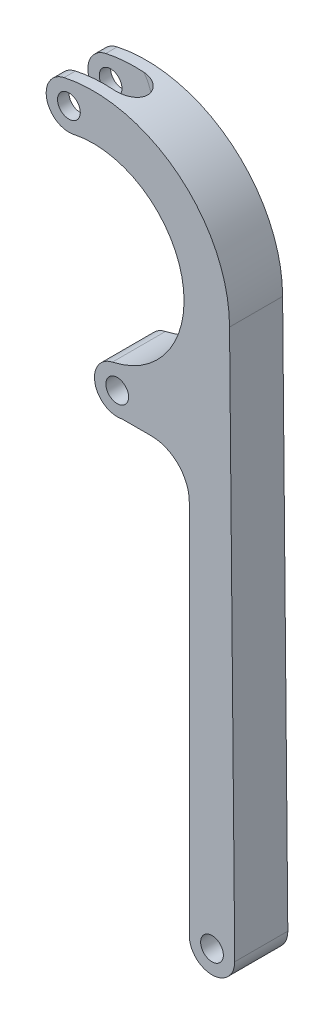
ISO-10303-21;
HEADER;
FILE_DESCRIPTION(('STEP AP214'),'2;1');
FILE_NAME('part.step','',(''),(''),'','','');
FILE_SCHEMA(('AUTOMOTIVE_DESIGN { 1 0 10303 214 1 1 1 1 }'));
ENDSEC;
DATA;
#1=APPLICATION_CONTEXT('core data for automotive mechanical design processes');
#2=APPLICATION_PROTOCOL_DEFINITION('international standard','automotive_design',2000,#1);
#3=PRODUCT_CONTEXT('',#1,'mechanical');
#4=PRODUCT('Part','Part','',(#3));
#5=PRODUCT_RELATED_PRODUCT_CATEGORY('part','',(#4));
#6=PRODUCT_DEFINITION_FORMATION('','',#4);
#7=PRODUCT_DEFINITION_CONTEXT('part definition',#1,'design');
#8=PRODUCT_DEFINITION('design','',#6,#7);
#9=PRODUCT_DEFINITION_SHAPE('','',#8);
#10=(LENGTH_UNIT() NAMED_UNIT(*) SI_UNIT(.MILLI.,.METRE.));
#11=(NAMED_UNIT(*) PLANE_ANGLE_UNIT() SI_UNIT($,.RADIAN.));
#12=(NAMED_UNIT(*) SI_UNIT($,.STERADIAN.) SOLID_ANGLE_UNIT());
#13=UNCERTAINTY_MEASURE_WITH_UNIT(LENGTH_MEASURE(1.E-05),#10,'distance_accuracy_value','');
#14=(GEOMETRIC_REPRESENTATION_CONTEXT(3) GLOBAL_UNCERTAINTY_ASSIGNED_CONTEXT((#13)) GLOBAL_UNIT_ASSIGNED_CONTEXT((#10,
#11,#12)) REPRESENTATION_CONTEXT('',''));
#15=CARTESIAN_POINT('',(0.,0.,0.));
#16=DIRECTION('',(0.,0.,1.));
#17=DIRECTION('',(1.,0.,0.));
#18=AXIS2_PLACEMENT_3D('',#15,#16,#17);
#19=CARTESIAN_POINT('',(-31.3728893299313,144.315290917684,14.));
#20=DIRECTION('',(0.,0.,-1.));
#21=DIRECTION('',(-1.,0.,0.));
#22=AXIS2_PLACEMENT_3D('',#19,#20,#21);
#23=CYLINDRICAL_SURFACE('',#22,36.);
#24=CARTESIAN_POINT('',(-31.3728893299313,144.315290917684,3.));
#25=DIRECTION('',(0.,0.,1.));
#26=DIRECTION('',(1.,0.,0.));
#27=AXIS2_PLACEMENT_3D('',#24,#25,#26);
#28=CIRCLE('',#27,36.);
#29=CARTESIAN_POINT('',(-28.9479901937246,180.233529518418,3.));
#30=VERTEX_POINT('',#29);
#31=CARTESIAN_POINT('',(-39.0203565258489,179.493640018905,3.));
#32=VERTEX_POINT('',#31);
#33=EDGE_CURVE('E206',#30,#32,#28,.T.);
#34=ORIENTED_EDGE('',*,*,#33,.F.);
#35=CARTESIAN_POINT('',(-28.9479901937246,180.233529518418,3.));
#36=CARTESIAN_POINT('',(-28.7795770568085,180.22216984961,3.00000045385362));
#37=CARTESIAN_POINT('',(-28.6112037438947,180.209602817332,3.00613336119898));
#38=CARTESIAN_POINT('',(-28.2754195237185,180.182182308598,3.03118744930425));
#39=CARTESIAN_POINT('',(-28.1080098703035,180.167326346729,3.05012260791562));
#40=CARTESIAN_POINT('',(-27.774298860757,180.135375466643,3.10147761181141));
#41=CARTESIAN_POINT('',(-27.6080123581459,180.11826626739,3.13398661023149));
#42=CARTESIAN_POINT('',(-27.2791009242743,180.082151242318,3.21295336145437));
#43=CARTESIAN_POINT('',(-27.1164743130056,180.063146309404,3.25940456790079));
#44=CARTESIAN_POINT('',(-26.6936280261687,180.010868514646,3.4011255225236));
#45=CARTESIAN_POINT('',(-26.4375101168995,179.976244002783,3.50861757906822));
#46=CARTESIAN_POINT('',(-25.9470883056509,179.904923404875,3.76359822497031));
#47=CARTESIAN_POINT('',(-25.7127213989245,179.868233830316,3.91096612226816));
#48=CARTESIAN_POINT('',(-25.3122735439438,179.801947309506,4.21714219033011));
#49=CARTESIAN_POINT('',(-25.1413907592226,179.772220222258,4.36957398920457));
#50=CARTESIAN_POINT('',(-24.905510629598,179.729687104965,4.61794944811057));
#51=CARTESIAN_POINT('',(-24.8302433366596,179.715842873747,4.70410002418329));
#52=CARTESIAN_POINT('',(-24.6873893509335,179.689142202842,4.88266955039365));
#53=CARTESIAN_POINT('',(-24.6197991910184,179.67628531811,4.97508564056015));
#54=CARTESIAN_POINT('',(-24.4925842095496,179.651754280422,5.16662098814801));
#55=CARTESIAN_POINT('',(-24.4330364676256,179.640091800642,5.26579304268483));
#56=CARTESIAN_POINT('',(-24.323538534103,179.618403645534,5.46941697841905));
#57=CARTESIAN_POINT('',(-24.2735830434926,179.608377066954,5.57386590401637));
#58=CARTESIAN_POINT('',(-24.1841295218186,179.590265300523,5.78712510066476));
#59=CARTESIAN_POINT('',(-24.1446147890766,179.582177014013,5.8959280816446));
#60=CARTESIAN_POINT('',(-24.0766695057924,179.568182639053,6.11702134767248));
#61=CARTESIAN_POINT('',(-24.0482324603552,179.562275272026,6.22930954749654));
#62=CARTESIAN_POINT('',(-24.0040553419754,179.55306608466,6.45088889530806));
#63=CARTESIAN_POINT('',(-23.9877744159436,179.549653439117,6.56006758396653));
#64=CARTESIAN_POINT('',(-23.9660117217184,179.545082100899,6.77949131024113));
#65=CARTESIAN_POINT('',(-23.9605251923654,179.543922414499,6.88973585615964));
#66=CARTESIAN_POINT('',(-23.9605600332046,179.543935149287,7.));
#67=B_SPLINE_CURVE_WITH_KNOTS('',3,(#35,#36,#37,#38,#39,#40,#41,#42,#43,#44,#45,#46,#47,#48,#49,
#50,#51,#52,#53,#54,#55,#56,#57,#58,#59,#60,#61,#62,#63,#64,#65,#66),.UNSPECIFIED.,.F.,.F.,(4,2,
2,2,2,2,2,2,2,2,2,2,2,2,2,4),(0.,0.506331687418498,1.01321709641114,1.5234854491179,
2.0335145867168,2.86972912066764,3.70344046291756,4.39309837160743,4.73843681901375,
5.083618680161,5.43190404937826,5.77999645954443,6.12752862151333,6.47485671611996,
6.80562039055201,7.13623814001269),.UNSPECIFIED.);
#68=CARTESIAN_POINT('',(-23.9605600332046,179.543935149288,7.));
#69=VERTEX_POINT('',#68);
#70=EDGE_CURVE('E45',#30,#69,#67,.T.);
#71=ORIENTED_EDGE('',*,*,#70,.T.);
#72=CARTESIAN_POINT('',(-23.9605600332046,179.543935149288,7.));
#73=CARTESIAN_POINT('',(-23.9605390359983,179.543927381125,7.09763453826813));
#74=CARTESIAN_POINT('',(-23.9648350243243,179.544834555989,7.19525790085211));
#75=CARTESIAN_POINT('',(-23.9818998463653,179.54842039755,7.38968910717928));
#76=CARTESIAN_POINT('',(-23.9946651661655,179.55109832956,7.48649727228477));
#77=CARTESIAN_POINT('',(-24.0284211619861,179.558149289769,7.67809554084558));
#78=CARTESIAN_POINT('',(-24.0493694034945,179.56251357175,7.77289343729455));
#79=CARTESIAN_POINT('',(-24.0991790551356,179.572826049637,7.96027618100451));
#80=CARTESIAN_POINT('',(-24.1280409363155,179.578774339828,8.05286089617254));
#81=CARTESIAN_POINT('',(-24.2258815890671,179.598782048608,8.32610659932321));
#82=CARTESIAN_POINT('',(-24.3061912580322,179.615020626096,8.50267888516191));
#83=CARTESIAN_POINT('',(-24.493251902258,179.651952156266,8.840675288737));
#84=CARTESIAN_POINT('',(-24.6000308426015,179.672649816971,9.00208313474946));
#85=CARTESIAN_POINT('',(-24.8430377187636,179.718358472298,9.31648755224717));
#86=CARTESIAN_POINT('',(-24.9806632490922,179.743555404174,9.46837294987783));
#87=CARTESIAN_POINT('',(-25.2760912297285,179.795589207871,9.75057447119266));
#88=CARTESIAN_POINT('',(-25.4338996813555,179.822426566222,9.88088415286238));
#89=CARTESIAN_POINT('',(-25.7929934799788,179.880766246256,10.1392919684144));
#90=CARTESIAN_POINT('',(-25.9971407976064,179.912300293487,10.2633987468435));
#91=CARTESIAN_POINT('',(-26.4210482244992,179.973743735603,10.4817667129386));
#92=CARTESIAN_POINT('',(-26.6408211004211,180.003651765938,10.5760031442402));
#93=CARTESIAN_POINT('',(-27.1341867993963,180.065904930496,10.7508112261382));
#94=CARTESIAN_POINT('',(-27.4100119067145,180.097615625276,10.8252862230458));
#95=CARTESIAN_POINT('',(-27.969701804709,180.155177061006,10.9351670561534));
#96=CARTESIAN_POINT('',(-28.2535623959536,180.181030801507,10.9705929268774));
#97=CARTESIAN_POINT('',(-28.6066914699344,180.208923722046,10.991864372818));
#98=CARTESIAN_POINT('',(-28.6749541064659,180.214118995282,10.9949262630547));
#99=CARTESIAN_POINT('',(-28.8114651730549,180.224116603336,10.998991903329));
#100=CARTESIAN_POINT('',(-28.8797134669732,180.228919523455,10.9999987748663));
#101=CARTESIAN_POINT('',(-28.9479901937246,180.233529518418,11.));
#102=B_SPLINE_CURVE_WITH_KNOTS('',3,(#72,#73,#74,#75,#76,#77,#78,#79,#80,#81,#82,#83,#84,#85,
#86,#87,#88,#89,#90,#91,#92,#93,#94,#95,#96,#97,#98,#99,#100,#101),.UNSPECIFIED.,.F.,.F.,(4,2,2,
2,2,2,2,2,2,2,2,2,2,2,4),(0.,0.292786386882828,0.585451372972699,0.876618402825911,
1.16780276770935,1.74890745554863,2.33062872340416,2.94778295442163,3.56512112255338,
4.285390235736,5.00625475215072,5.8655120095498,6.72432821138149,6.92989819626401,
7.13515569462084),.UNSPECIFIED.);
#103=CARTESIAN_POINT('',(-28.9479901937246,180.233529518418,11.));
#104=VERTEX_POINT('',#103);
#105=EDGE_CURVE('E177',#69,#104,#102,.T.);
#106=ORIENTED_EDGE('',*,*,#105,.T.);
#107=CARTESIAN_POINT('',(-31.3728893299313,144.315290917684,11.));
#108=DIRECTION('',(0.,0.,1.));
#109=DIRECTION('',(1.,0.,0.));
#110=AXIS2_PLACEMENT_3D('',#107,#108,#109);
#111=CIRCLE('',#110,36.);
#112=CARTESIAN_POINT('',(-39.0203565258489,179.493640018905,11.));
#113=VERTEX_POINT('',#112);
#114=EDGE_CURVE('E155',#104,#113,#111,.T.);
#115=ORIENTED_EDGE('',*,*,#114,.T.);
#116=DIRECTION('',(0.,0.,-1.));
#117=VECTOR('',#116,1.);
#118=CARTESIAN_POINT('',(-39.0203565258489,179.493640018905,14.));
#119=LINE('',#118,#117);
#120=CARTESIAN_POINT('',(-39.0203565258489,179.493640018905,14.));
#121=VERTEX_POINT('',#120);
#122=EDGE_CURVE('E154',#121,#113,#119,.T.);
#123=ORIENTED_EDGE('',*,*,#122,.F.);
#124=CARTESIAN_POINT('',(-31.3728893299313,144.315290917684,14.));
#125=DIRECTION('',(0.,0.,1.));
#126=DIRECTION('',(1.,0.,0.));
#127=AXIS2_PLACEMENT_3D('',#124,#125,#126);
#128=CIRCLE('',#127,36.);
#129=CARTESIAN_POINT('',(4.6271106700687,144.315290917684,14.));
#130=VERTEX_POINT('',#129);
#131=EDGE_CURVE('E310',#130,#121,#128,.T.);
#132=ORIENTED_EDGE('',*,*,#131,.F.);
#133=DIRECTION('',(0.,0.,-1.));
#134=VECTOR('',#133,1.);
#135=CARTESIAN_POINT('',(4.6271106700687,144.315290917684,14.));
#136=LINE('',#135,#134);
#137=CARTESIAN_POINT('',(4.6271106700687,144.315290917684,0.));
#138=VERTEX_POINT('',#137);
#139=EDGE_CURVE('E269',#130,#138,#136,.T.);
#140=ORIENTED_EDGE('',*,*,#139,.T.);
#141=CARTESIAN_POINT('',(-31.3728893299313,144.315290917684,0.));
#142=DIRECTION('',(0.,0.,1.));
#143=DIRECTION('',(1.,0.,0.));
#144=AXIS2_PLACEMENT_3D('',#141,#142,#143);
#145=CIRCLE('',#144,36.);
#146=CARTESIAN_POINT('',(-39.0203565258489,179.493640018905,0.));
#147=VERTEX_POINT('',#146);
#148=EDGE_CURVE('E211',#138,#147,#145,.T.);
#149=ORIENTED_EDGE('',*,*,#148,.T.);
#150=EDGE_CURVE('E160',#32,#147,#119,.T.);
#151=ORIENTED_EDGE('',*,*,#150,.F.);
#152=EDGE_LOOP('',(#34,#71,#106,#115,#123,#132,#140,#149,#151));
#153=FACE_BOUND('',#152,.T.);
#154=ADVANCED_FACE('F35',(#153),#23,.T.);
#155=CARTESIAN_POINT('',(-37.7457786598626,173.630581835368,14.));
#156=DIRECTION('',(0.,0.,-1.));
#157=DIRECTION('',(-1.,0.,0.));
#158=AXIS2_PLACEMENT_3D('',#155,#156,#157);
#159=CYLINDRICAL_SURFACE('',#158,6.);
#160=CARTESIAN_POINT('',(-37.7457786598626,173.630581835368,3.));
#161=DIRECTION('',(0.,0.,1.));
#162=DIRECTION('',(1.,0.,0.));
#163=AXIS2_PLACEMENT_3D('',#160,#161,#162);
#164=CIRCLE('',#163,6.);
#165=CARTESIAN_POINT('',(-36.4712007938764,167.767523651831,3.));
#166=VERTEX_POINT('',#165);
#167=EDGE_CURVE('E212',#32,#166,#164,.T.);
#168=ORIENTED_EDGE('',*,*,#167,.F.);
#169=ORIENTED_EDGE('',*,*,#150,.T.);
#170=CARTESIAN_POINT('',(-37.7457786598626,173.630581835368,0.));
#171=DIRECTION('',(0.,0.,1.));
#172=DIRECTION('',(1.,0.,0.));
#173=AXIS2_PLACEMENT_3D('',#170,#171,#172);
#174=CIRCLE('',#173,6.);
#175=CARTESIAN_POINT('',(-36.4712007938764,167.767523651831,0.));
#176=VERTEX_POINT('',#175);
#177=EDGE_CURVE('E277',#147,#176,#174,.T.);
#178=ORIENTED_EDGE('',*,*,#177,.T.);
#179=DIRECTION('',(0.,0.,-1.));
#180=VECTOR('',#179,1.);
#181=CARTESIAN_POINT('',(-36.4712007938764,167.767523651831,14.));
#182=LINE('',#181,#180);
#183=EDGE_CURVE('E161',#166,#176,#182,.T.);
#184=ORIENTED_EDGE('',*,*,#183,.F.);
#185=EDGE_LOOP('',(#168,#169,#178,#184));
#186=FACE_BOUND('',#185,.T.);
#187=ADVANCED_FACE('F200',(#186),#159,.T.);
#188=CARTESIAN_POINT('',(-31.3728893299313,144.315290917684,14.));
#189=DIRECTION('',(0.,0.,-1.));
#190=DIRECTION('',(-1.,0.,0.));
#191=AXIS2_PLACEMENT_3D('',#188,#189,#190);
#192=CYLINDRICAL_SURFACE('',#191,24.);
#193=CARTESIAN_POINT('',(-28.2320581462812,168.108886263403,11.));
#194=CARTESIAN_POINT('',(-28.1132038579012,168.093205656364,11.0000156342808));
#195=CARTESIAN_POINT('',(-27.9944460880994,168.076614923278,10.995407358767));
#196=CARTESIAN_POINT('',(-27.7578742170777,168.041771032219,10.9767273571227));
#197=CARTESIAN_POINT('',(-27.6400605409011,168.023517166715,10.9626515869216));
#198=CARTESIAN_POINT('',(-27.4060348850144,167.985486742715,10.924788945821));
#199=CARTESIAN_POINT('',(-27.2898259143121,167.965707688126,10.9009858694993));
#200=CARTESIAN_POINT('',(-27.060090987255,167.924894305285,10.8435877593124));
#201=CARTESIAN_POINT('',(-26.9465646264443,167.903860167971,10.8099942118683));
#202=CARTESIAN_POINT('',(-26.7227413980658,167.860760796419,10.7329316543777));
#203=CARTESIAN_POINT('',(-26.6124544951594,167.838692832452,10.6894351761463));
#204=CARTESIAN_POINT('',(-26.3962909780126,167.793912201118,10.5927541725508));
#205=CARTESIAN_POINT('',(-26.290416064566,167.771199290698,10.5395659527645));
#206=CARTESIAN_POINT('',(-26.0841566993723,167.725554655109,10.4238854796658));
#207=CARTESIAN_POINT('',(-25.9837636675694,167.702623341948,10.3614083710445));
#208=CARTESIAN_POINT('',(-25.7890728862017,167.656906069204,10.2274607042863));
#209=CARTESIAN_POINT('',(-25.6947773052786,167.634120163907,10.15598697272));
#210=CARTESIAN_POINT('',(-25.5180114440172,167.590347202525,10.0086775724302));
#211=CARTESIAN_POINT('',(-25.4351774076616,167.569329515636,9.93328701868262));
#212=CARTESIAN_POINT('',(-25.2762549861329,167.528170766636,9.77542574940758));
#213=CARTESIAN_POINT('',(-25.200169061437,167.508030025626,9.69295247279585));
#214=CARTESIAN_POINT('',(-25.0553116989439,167.468991353547,9.52152874041109));
#215=CARTESIAN_POINT('',(-24.9865404229735,167.450093449977,9.43257814140924));
#216=CARTESIAN_POINT('',(-24.8567791530108,167.413880534224,9.24885491079914));
#217=CARTESIAN_POINT('',(-24.7957919103713,167.396566082339,9.15408023804637));
#218=CARTESIAN_POINT('',(-24.6277546943914,167.348236754498,8.86648441244799));
#219=CARTESIAN_POINT('',(-24.5322067845964,167.319893453601,8.66631274855984));
#220=CARTESIAN_POINT('',(-24.3750378199673,167.272574495183,8.25224523140534));
#221=CARTESIAN_POINT('',(-24.3133902703329,167.253591523305,8.0383602421863));
#222=CARTESIAN_POINT('',(-24.2420593217259,167.231487318174,7.68579528755043));
#223=CARTESIAN_POINT('',(-24.2215314746653,167.225079771836,7.54942201262831));
#224=CARTESIAN_POINT('',(-24.1941613216893,167.216512089066,7.27538351280315));
#225=CARTESIAN_POINT('',(-24.1872985885254,167.214345612966,7.13772052581551));
#226=CARTESIAN_POINT('',(-24.1873084351455,167.214361361798,7.));
#227=B_SPLINE_CURVE_WITH_KNOTS('',3,(#193,#194,#195,#196,#197,#198,#199,#200,#201,#202,#203,
#204,#205,#206,#207,#208,#209,#210,#211,#212,#213,#214,#215,#216,#217,#218,#219,#220,#221,#222,
#223,#224,#225,#226),.UNSPECIFIED.,.F.,.F.,(4,2,2,2,2,2,2,2,2,2,2,2,2,2,2,2,4),(0.,
0.359594922636991,0.719343545026276,1.07969395791203,1.43998968970729,1.80129723481446,
2.16274279698239,2.5236053893548,2.88459562940481,3.22605796457053,3.5676442952638,
3.9092381815278,4.25095247552542,4.91837250355704,5.58527016593029,5.99874971644978,
6.4116107130744),.UNSPECIFIED.);
#228=CARTESIAN_POINT('',(-28.2320581462812,168.108886263403,11.));
#229=VERTEX_POINT('',#228);
#230=CARTESIAN_POINT('',(-24.1873084351456,167.214361361798,7.));
#231=VERTEX_POINT('',#230);
#232=EDGE_CURVE('E51',#229,#231,#227,.T.);
#233=ORIENTED_EDGE('',*,*,#232,.T.);
#234=CARTESIAN_POINT('',(-24.1873084351456,167.214361361798,7.));
#235=CARTESIAN_POINT('',(-24.1872990476954,167.214352306921,6.88866573990113));
#236=CARTESIAN_POINT('',(-24.1917855649749,167.215766063678,6.77733301062676));
#237=CARTESIAN_POINT('',(-24.2096828165437,167.221373846479,6.55546193209507));
#238=CARTESIAN_POINT('',(-24.223093193515,167.225567761203,6.44492355121056));
#239=CARTESIAN_POINT('',(-24.2587574967053,167.236666443544,6.22550395225878));
#240=CARTESIAN_POINT('',(-24.2810049286375,167.243569220393,6.1166215780793));
#241=CARTESIAN_POINT('',(-24.3342092441014,167.259958315889,5.90120608821957));
#242=CARTESIAN_POINT('',(-24.3651660040211,167.269444597869,5.79467293921979));
#243=CARTESIAN_POINT('',(-24.4356175598808,167.29083473021,5.58467573576111));
#244=CARTESIAN_POINT('',(-24.4751153454292,167.302739426998,5.48121277041378));
#245=CARTESIAN_POINT('',(-24.5624183758654,167.328755667838,5.27809497031777));
#246=CARTESIAN_POINT('',(-24.6102266802478,167.342868024441,5.17844155458479));
#247=CARTESIAN_POINT('',(-24.7138161129311,167.37303692282,4.98374550292935));
#248=CARTESIAN_POINT('',(-24.7695929973704,167.389092429033,4.88870044857111));
#249=CARTESIAN_POINT('',(-24.8888060395813,167.422876291165,4.70380504035586));
#250=CARTESIAN_POINT('',(-24.9522450051164,167.4406052598,4.61395660874274));
#251=CARTESIAN_POINT('',(-25.0862469952877,167.477392422343,4.44026146263383));
#252=CARTESIAN_POINT('',(-25.1567986878788,167.496448487388,4.35640555401584));
#253=CARTESIAN_POINT('',(-25.3046664814596,167.535594985163,4.1950895264299));
#254=CARTESIAN_POINT('',(-25.3819850569468,167.555685795162,4.11763176741773));
#255=CARTESIAN_POINT('',(-25.5427988096175,167.596547796144,3.96970228556316));
#256=CARTESIAN_POINT('',(-25.626290930456,167.617318647657,3.89922714573194));
#257=CARTESIAN_POINT('',(-25.7989393731989,167.65921890646,3.76564512495483));
#258=CARTESIAN_POINT('',(-25.8880977490861,167.680348441713,3.7025409397305));
#259=CARTESIAN_POINT('',(-26.0717650343891,167.722704130289,3.58388617897434));
#260=CARTESIAN_POINT('',(-26.1662923698337,167.743930353729,3.52836415880804));
#261=CARTESIAN_POINT('',(-26.3597652645137,167.786089667647,3.42542041758196));
#262=CARTESIAN_POINT('',(-26.4587124956963,167.807022643195,3.37800179515271));
#263=CARTESIAN_POINT('',(-26.6603132211899,167.848293404858,3.29148760399817));
#264=CARTESIAN_POINT('',(-26.7629670264399,167.868631140781,3.25239273544649));
#265=CARTESIAN_POINT('',(-26.9712685112661,167.908446752838,3.18263079078626));
#266=CARTESIAN_POINT('',(-27.0769170271626,167.927924384813,3.15196609503209));
#267=CARTESIAN_POINT('',(-27.3546511303471,167.977154369875,3.08323202443599));
#268=CARTESIAN_POINT('',(-27.5285780410851,168.006062331741,3.0517530202292));
#269=CARTESIAN_POINT('',(-27.7914115575182,168.046723774209,3.02054709702058));
#270=CARTESIAN_POINT('',(-27.8792633378854,168.059816494111,3.01281365872794));
#271=CARTESIAN_POINT('',(-28.055399982501,168.085065376431,3.00254100403166));
#272=CARTESIAN_POINT('',(-28.1436848205396,168.097221594802,3.00000147707228));
#273=CARTESIAN_POINT('',(-28.2320581462812,168.108886263403,3.));
#274=B_SPLINE_CURVE_WITH_KNOTS('',3,(#234,#235,#236,#237,#238,#239,#240,#241,#242,#243,#244,
#245,#246,#247,#248,#249,#250,#251,#252,#253,#254,#255,#256,#257,#258,#259,#260,#261,#262,#263,
#264,#265,#266,#267,#268,#269,#270,#271,#272,#273),.UNSPECIFIED.,.F.,.F.,(4,2,2,2,2,2,2,2,2,2,2,
2,2,2,2,2,2,2,2,4),(0.,0.333901328774878,0.667789288689591,1.00143232941566,1.33507063496777,
1.66882591325289,2.00270432385602,2.33640557767879,2.67022948921497,3.00352971195883,
3.3369523284828,3.67021096821147,4.00359110891537,4.33819407580452,4.67292470546216,
5.00768348071847,5.34253668203422,5.87823215495221,6.14557919362095,6.41291024653623),.UNSPECIFIED.);
#275=CARTESIAN_POINT('',(-28.2320581462812,168.108886263403,3.));
#276=VERTEX_POINT('',#275);
#277=EDGE_CURVE('E11',#231,#276,#274,.T.);
#278=ORIENTED_EDGE('',*,*,#277,.T.);
#279=CARTESIAN_POINT('',(-31.3728893299313,144.315290917684,3.));
#280=DIRECTION('',(0.,0.,1.));
#281=DIRECTION('',(1.,0.,0.));
#282=AXIS2_PLACEMENT_3D('',#279,#280,#281);
#283=CIRCLE('',#282,24.);
#284=EDGE_CURVE('E173',#276,#166,#283,.T.);
#285=ORIENTED_EDGE('',*,*,#284,.T.);
#286=ORIENTED_EDGE('',*,*,#183,.T.);
#287=CARTESIAN_POINT('',(-31.3728893299313,144.315290917684,0.));
#288=DIRECTION('',(0.,0.,1.));
#289=DIRECTION('',(1.,0.,0.));
#290=AXIS2_PLACEMENT_3D('',#287,#288,#289);
#291=CIRCLE('',#290,24.);
#292=CARTESIAN_POINT('',(-26.2745778659863,120.863058183537,0.));
#293=VERTEX_POINT('',#292);
#294=EDGE_CURVE('E280',#293,#176,#291,.T.);
#295=ORIENTED_EDGE('',*,*,#294,.F.);
#296=DIRECTION('',(0.,0.,-1.));
#297=VECTOR('',#296,1.);
#298=CARTESIAN_POINT('',(-26.2745778659863,120.863058183537,14.));
#299=LINE('',#298,#297);
#300=CARTESIAN_POINT('',(-26.2745778659863,120.863058183537,14.));
#301=VERTEX_POINT('',#300);
#302=EDGE_CURVE('E164',#301,#293,#299,.T.);
#303=ORIENTED_EDGE('',*,*,#302,.F.);
#304=CARTESIAN_POINT('',(-31.3728893299313,144.315290917684,14.));
#305=DIRECTION('',(0.,0.,1.));
#306=DIRECTION('',(1.,0.,0.));
#307=AXIS2_PLACEMENT_3D('',#304,#305,#306);
#308=CIRCLE('',#307,24.);
#309=CARTESIAN_POINT('',(-36.4712007938764,167.767523651831,14.));
#310=VERTEX_POINT('',#309);
#311=EDGE_CURVE('E159',#301,#310,#308,.T.);
#312=ORIENTED_EDGE('',*,*,#311,.T.);
#313=CARTESIAN_POINT('',(-36.4712007938764,167.767523651831,11.));
#314=VERTEX_POINT('',#313);
#315=EDGE_CURVE('E151',#310,#314,#182,.T.);
#316=ORIENTED_EDGE('',*,*,#315,.T.);
#317=CARTESIAN_POINT('',(-31.3728893299313,144.315290917684,11.));
#318=DIRECTION('',(0.,0.,1.));
#319=DIRECTION('',(1.,0.,0.));
#320=AXIS2_PLACEMENT_3D('',#317,#318,#319);
#321=CIRCLE('',#320,24.);
#322=EDGE_CURVE('E137',#229,#314,#321,.T.);
#323=ORIENTED_EDGE('',*,*,#322,.F.);
#324=EDGE_LOOP('',(#233,#278,#285,#286,#295,#303,#312,#316,#323));
#325=FACE_BOUND('',#324,.T.);
#326=ADVANCED_FACE('F157',(#325),#192,.F.);
#327=CARTESIAN_POINT('',(-37.7457786598626,173.630581835368,14.));
#328=DIRECTION('',(0.,0.,-1.));
#329=DIRECTION('',(-1.,0.,0.));
#330=AXIS2_PLACEMENT_3D('',#327,#328,#329);
#331=CYLINDRICAL_SURFACE('',#330,3.);
#332=CARTESIAN_POINT('',(-37.7457786598626,173.630581835368,0.));
#333=DIRECTION('',(0.,0.,1.));
#334=DIRECTION('',(1.,0.,0.));
#335=AXIS2_PLACEMENT_3D('',#332,#333,#334);
#336=CIRCLE('',#335,3.);
#337=CARTESIAN_POINT('',(-34.7457786598626,173.630581835368,0.));
#338=VERTEX_POINT('',#337);
#339=EDGE_CURVE('E304',#338,#338,#336,.T.);
#340=ORIENTED_EDGE('',*,*,#339,.F.);
#341=EDGE_LOOP('',(#340));
#342=FACE_BOUND('',#341,.T.);
#343=CARTESIAN_POINT('',(-37.7457786598626,173.630581835368,3.));
#344=DIRECTION('',(0.,0.,1.));
#345=DIRECTION('',(1.,0.,0.));
#346=AXIS2_PLACEMENT_3D('',#343,#344,#345);
#347=CIRCLE('',#346,3.);
#348=CARTESIAN_POINT('',(-34.7457786598626,173.630581835368,3.));
#349=VERTEX_POINT('',#348);
#350=EDGE_CURVE('E170',#349,#349,#347,.T.);
#351=ORIENTED_EDGE('',*,*,#350,.T.);
#352=EDGE_LOOP('',(#351));
#353=FACE_BOUND('',#352,.T.);
#354=ADVANCED_FACE('F226',(#342,#353),#331,.F.);
#355=ORIENTED_EDGE('',*,*,#122,.T.);
#356=CARTESIAN_POINT('',(-37.7457786598626,173.630581835368,11.));
#357=DIRECTION('',(0.,0.,1.));
#358=DIRECTION('',(1.,0.,0.));
#359=AXIS2_PLACEMENT_3D('',#356,#357,#358);
#360=CIRCLE('',#359,6.);
#361=EDGE_CURVE('E141',#113,#314,#360,.T.);
#362=ORIENTED_EDGE('',*,*,#361,.T.);
#363=ORIENTED_EDGE('',*,*,#315,.F.);
#364=CARTESIAN_POINT('',(-37.7457786598626,173.630581835368,14.));
#365=DIRECTION('',(0.,0.,1.));
#366=DIRECTION('',(1.,0.,0.));
#367=AXIS2_PLACEMENT_3D('',#364,#365,#366);
#368=CIRCLE('',#367,6.);
#369=EDGE_CURVE('E367',#121,#310,#368,.T.);
#370=ORIENTED_EDGE('',*,*,#369,.F.);
#371=EDGE_LOOP('',(#355,#362,#363,#370));
#372=FACE_BOUND('',#371,.T.);
#373=ADVANCED_FACE('F150',(#372),#159,.T.);
#374=CARTESIAN_POINT('',(-25.,115.,14.));
#375=DIRECTION('',(0.,0.,-1.));
#376=DIRECTION('',(-1.,0.,0.));
#377=AXIS2_PLACEMENT_3D('',#374,#375,#376);
#378=CYLINDRICAL_SURFACE('',#377,6.);
#379=CARTESIAN_POINT('',(-25.,115.,0.));
#380=DIRECTION('',(0.,0.,1.));
#381=DIRECTION('',(1.,0.,0.));
#382=AXIS2_PLACEMENT_3D('',#379,#380,#381);
#383=CIRCLE('',#382,6.);
#384=CARTESIAN_POINT('',(-23.7254221340137,109.136941816463,0.));
#385=VERTEX_POINT('',#384);
#386=EDGE_CURVE('E283',#293,#385,#383,.T.);
#387=ORIENTED_EDGE('',*,*,#386,.T.);
#388=DIRECTION('',(0.,0.,-1.));
#389=VECTOR('',#388,1.);
#390=CARTESIAN_POINT('',(-23.7254221340137,109.136941816463,14.));
#391=LINE('',#390,#389);
#392=CARTESIAN_POINT('',(-23.7254221340137,109.136941816463,14.));
#393=VERTEX_POINT('',#392);
#394=EDGE_CURVE('E319',#393,#385,#391,.T.);
#395=ORIENTED_EDGE('',*,*,#394,.F.);
#396=CARTESIAN_POINT('',(-25.,115.,14.));
#397=DIRECTION('',(0.,0.,1.));
#398=DIRECTION('',(1.,0.,0.));
#399=AXIS2_PLACEMENT_3D('',#396,#397,#398);
#400=CIRCLE('',#399,6.);
#401=EDGE_CURVE('E326',#301,#393,#400,.T.);
#402=ORIENTED_EDGE('',*,*,#401,.F.);
#403=ORIENTED_EDGE('',*,*,#302,.T.);
#404=EDGE_LOOP('',(#387,#395,#402,#403));
#405=FACE_BOUND('',#404,.T.);
#406=ADVANCED_FACE('F227',(#405),#378,.T.);
#407=CARTESIAN_POINT('',(0.,109.136941816463,14.));
#408=DIRECTION('',(0.,-1.,0.));
#409=DIRECTION('',(0.,0.,-1.));
#410=AXIS2_PLACEMENT_3D('',#407,#408,#409);
#411=PLANE('',#410);
#412=DIRECTION('',(-1.,0.,0.));
#413=VECTOR('',#412,1.);
#414=CARTESIAN_POINT('',(0.,109.136941816463,0.));
#415=LINE('',#414,#413);
#416=CARTESIAN_POINT('',(-16.0000000000001,109.136941816463,0.));
#417=VERTEX_POINT('',#416);
#418=EDGE_CURVE('E286',#417,#385,#415,.T.);
#419=ORIENTED_EDGE('',*,*,#418,.F.);
#420=DIRECTION('',(0.,0.,-1.));
#421=VECTOR('',#420,1.);
#422=CARTESIAN_POINT('',(-16.0000000000001,109.136941816463,14.));
#423=LINE('',#422,#421);
#424=CARTESIAN_POINT('',(-16.0000000000001,109.136941816463,14.));
#425=VERTEX_POINT('',#424);
#426=EDGE_CURVE('E318',#425,#417,#423,.T.);
#427=ORIENTED_EDGE('',*,*,#426,.F.);
#428=DIRECTION('',(-1.,0.,0.));
#429=VECTOR('',#428,1.);
#430=CARTESIAN_POINT('',(0.,109.136941816463,14.));
#431=LINE('',#430,#429);
#432=EDGE_CURVE('E355',#425,#393,#431,.T.);
#433=ORIENTED_EDGE('',*,*,#432,.T.);
#434=ORIENTED_EDGE('',*,*,#394,.T.);
#435=EDGE_LOOP('',(#419,#427,#433,#434));
#436=FACE_BOUND('',#435,.T.);
#437=ADVANCED_FACE('F235',(#436),#411,.T.);
#438=CARTESIAN_POINT('',(-16.,99.1369418164632,14.));
#439=DIRECTION('',(0.,0.,-1.));
#440=DIRECTION('',(-1.,0.,0.));
#441=AXIS2_PLACEMENT_3D('',#438,#439,#440);
#442=CYLINDRICAL_SURFACE('',#441,10.);
#443=CARTESIAN_POINT('',(-16.,99.1369418164632,0.));
#444=DIRECTION('',(0.,0.,1.));
#445=DIRECTION('',(1.,0.,0.));
#446=AXIS2_PLACEMENT_3D('',#443,#444,#445);
#447=CIRCLE('',#446,10.);
#448=CARTESIAN_POINT('',(-6.,99.1369418164631,0.));
#449=VERTEX_POINT('',#448);
#450=EDGE_CURVE('E289',#417,#449,#447,.F.);
#451=ORIENTED_EDGE('',*,*,#450,.T.);
#452=DIRECTION('',(0.,0.,-1.));
#453=VECTOR('',#452,1.);
#454=CARTESIAN_POINT('',(-6.,99.1369418164631,14.));
#455=LINE('',#454,#453);
#456=CARTESIAN_POINT('',(-6.,99.1369418164631,14.));
#457=VERTEX_POINT('',#456);
#458=EDGE_CURVE('E316',#457,#449,#455,.T.);
#459=ORIENTED_EDGE('',*,*,#458,.F.);
#460=CARTESIAN_POINT('',(-16.,99.1369418164632,14.));
#461=DIRECTION('',(0.,0.,1.));
#462=DIRECTION('',(1.,0.,0.));
#463=AXIS2_PLACEMENT_3D('',#460,#461,#462);
#464=CIRCLE('',#463,10.);
#465=EDGE_CURVE('E356',#425,#457,#464,.F.);
#466=ORIENTED_EDGE('',*,*,#465,.F.);
#467=ORIENTED_EDGE('',*,*,#426,.T.);
#468=EDGE_LOOP('',(#451,#459,#466,#467));
#469=FACE_BOUND('',#468,.T.);
#470=ADVANCED_FACE('F353',(#469),#442,.F.);
#471=CARTESIAN_POINT('',(-6.,0.,14.));
#472=DIRECTION('',(-1.,0.,0.));
#473=DIRECTION('',(0.,0.,1.));
#474=AXIS2_PLACEMENT_3D('',#471,#472,#473);
#475=PLANE('',#474);
#476=DIRECTION('',(0.,1.,0.));
#477=VECTOR('',#476,1.);
#478=CARTESIAN_POINT('',(-6.,0.,0.));
#479=LINE('',#478,#477);
#480=CARTESIAN_POINT('',(-6.,0.,0.));
#481=VERTEX_POINT('',#480);
#482=EDGE_CURVE('E292',#481,#449,#479,.T.);
#483=ORIENTED_EDGE('',*,*,#482,.F.);
#484=DIRECTION('',(0.,0.,-1.));
#485=VECTOR('',#484,1.);
#486=CARTESIAN_POINT('',(-6.,0.,14.));
#487=LINE('',#486,#485);
#488=CARTESIAN_POINT('',(-6.,0.,14.));
#489=VERTEX_POINT('',#488);
#490=EDGE_CURVE('E314',#489,#481,#487,.T.);
#491=ORIENTED_EDGE('',*,*,#490,.F.);
#492=DIRECTION('',(0.,1.,0.));
#493=VECTOR('',#492,1.);
#494=CARTESIAN_POINT('',(-6.,0.,14.));
#495=LINE('',#494,#493);
#496=EDGE_CURVE('E350',#489,#457,#495,.T.);
#497=ORIENTED_EDGE('',*,*,#496,.T.);
#498=ORIENTED_EDGE('',*,*,#458,.T.);
#499=EDGE_LOOP('',(#483,#491,#497,#498));
#500=FACE_BOUND('',#499,.T.);
#501=ADVANCED_FACE('F256',(#500),#475,.T.);
#502=CARTESIAN_POINT('',(0.,0.,14.));
#503=DIRECTION('',(0.,0.,-1.));
#504=DIRECTION('',(-1.,0.,0.));
#505=AXIS2_PLACEMENT_3D('',#502,#503,#504);
#506=CYLINDRICAL_SURFACE('',#505,6.);
#507=CARTESIAN_POINT('',(0.,0.,0.));
#508=DIRECTION('',(0.,0.,1.));
#509=DIRECTION('',(1.,0.,0.));
#510=AXIS2_PLACEMENT_3D('',#507,#508,#509);
#511=CIRCLE('',#510,6.);
#512=CARTESIAN_POINT('',(6.,0.,0.));
#513=VERTEX_POINT('',#512);
#514=EDGE_CURVE('E295',#481,#513,#511,.T.);
#515=ORIENTED_EDGE('',*,*,#514,.T.);
#516=DIRECTION('',(0.,0.,-1.));
#517=VECTOR('',#516,1.);
#518=CARTESIAN_POINT('',(6.,0.,14.));
#519=LINE('',#518,#517);
#520=CARTESIAN_POINT('',(6.,0.,14.));
#521=VERTEX_POINT('',#520);
#522=EDGE_CURVE('E312',#521,#513,#519,.T.);
#523=ORIENTED_EDGE('',*,*,#522,.F.);
#524=CARTESIAN_POINT('',(0.,0.,14.));
#525=DIRECTION('',(0.,0.,1.));
#526=DIRECTION('',(1.,0.,0.));
#527=AXIS2_PLACEMENT_3D('',#524,#525,#526);
#528=CIRCLE('',#527,6.);
#529=EDGE_CURVE('E366',#489,#521,#528,.T.);
#530=ORIENTED_EDGE('',*,*,#529,.F.);
#531=ORIENTED_EDGE('',*,*,#490,.T.);
#532=EDGE_LOOP('',(#515,#523,#530,#531));
#533=FACE_BOUND('',#532,.T.);
#534=ADVANCED_FACE('F248',(#533),#506,.T.);
#535=CARTESIAN_POINT('',(-37.7457786598626,173.630581835368,11.));
#536=DIRECTION('',(0.,0.,1.));
#537=DIRECTION('',(1.,0.,0.));
#538=AXIS2_PLACEMENT_3D('',#535,#536,#537);
#539=CIRCLE('',#538,3.);
#540=CARTESIAN_POINT('',(-34.7457786598626,173.630581835368,11.));
#541=VERTEX_POINT('',#540);
#542=EDGE_CURVE('E146',#541,#541,#539,.T.);
#543=ORIENTED_EDGE('',*,*,#542,.F.);
#544=EDGE_LOOP('',(#543));
#545=FACE_BOUND('',#544,.T.);
#546=CARTESIAN_POINT('',(-37.7457786598626,173.630581835368,14.));
#547=DIRECTION('',(0.,0.,1.));
#548=DIRECTION('',(1.,0.,0.));
#549=AXIS2_PLACEMENT_3D('',#546,#547,#548);
#550=CIRCLE('',#549,3.);
#551=CARTESIAN_POINT('',(-34.7457786598626,173.630581835368,14.));
#552=VERTEX_POINT('',#551);
#553=EDGE_CURVE('E263',#552,#552,#550,.T.);
#554=ORIENTED_EDGE('',*,*,#553,.T.);
#555=EDGE_LOOP('',(#554));
#556=FACE_BOUND('',#555,.T.);
#557=ADVANCED_FACE('F239',(#545,#556),#331,.F.);
#558=CARTESIAN_POINT('',(-25.,115.,14.));
#559=DIRECTION('',(0.,0.,-1.));
#560=DIRECTION('',(-1.,0.,0.));
#561=AXIS2_PLACEMENT_3D('',#558,#559,#560);
#562=CYLINDRICAL_SURFACE('',#561,3.);
#563=CARTESIAN_POINT('',(-25.,115.,14.));
#564=DIRECTION('',(0.,0.,1.));
#565=DIRECTION('',(1.,0.,0.));
#566=AXIS2_PLACEMENT_3D('',#563,#564,#565);
#567=CIRCLE('',#566,3.);
#568=CARTESIAN_POINT('',(-22.,115.,14.));
#569=VERTEX_POINT('',#568);
#570=EDGE_CURVE('E266',#569,#569,#567,.T.);
#571=ORIENTED_EDGE('',*,*,#570,.T.);
#572=EDGE_LOOP('',(#571));
#573=FACE_BOUND('',#572,.T.);
#574=CARTESIAN_POINT('',(-25.,115.,0.));
#575=DIRECTION('',(0.,0.,1.));
#576=DIRECTION('',(1.,0.,0.));
#577=AXIS2_PLACEMENT_3D('',#574,#575,#576);
#578=CIRCLE('',#577,3.);
#579=CARTESIAN_POINT('',(-22.,115.,0.));
#580=VERTEX_POINT('',#579);
#581=EDGE_CURVE('E301',#580,#580,#578,.T.);
#582=ORIENTED_EDGE('',*,*,#581,.F.);
#583=EDGE_LOOP('',(#582));
#584=FACE_BOUND('',#583,.T.);
#585=ADVANCED_FACE('F247',(#573,#584),#562,.F.);
#586=CARTESIAN_POINT('',(5.9994570519099,0.057073581874607,14.));
#587=DIRECTION('',(0.999954753302193,0.00951269406376146,0.));
#588=DIRECTION('',(-0.00951269406376146,0.999954753302193,0.));
#589=AXIS2_PLACEMENT_3D('',#586,#587,#588);
#590=PLANE('',#589);
#591=DIRECTION('',(0.00951269406376146,-0.999954753302193,0.));
#592=VECTOR('',#591,1.);
#593=CARTESIAN_POINT('',(5.9994570519099,0.057073581874607,0.));
#594=LINE('',#593,#592);
#595=EDGE_CURVE('E298',#138,#513,#594,.T.);
#596=ORIENTED_EDGE('',*,*,#595,.F.);
#597=ORIENTED_EDGE('',*,*,#139,.F.);
#598=DIRECTION('',(0.00951269406376146,-0.999954753302193,0.));
#599=VECTOR('',#598,1.);
#600=CARTESIAN_POINT('',(5.9994570519099,0.057073581874607,14.));
#601=LINE('',#600,#599);
#602=EDGE_CURVE('E272',#130,#521,#601,.T.);
#603=ORIENTED_EDGE('',*,*,#602,.T.);
#604=ORIENTED_EDGE('',*,*,#522,.T.);
#605=EDGE_LOOP('',(#596,#597,#603,#604));
#606=FACE_BOUND('',#605,.T.);
#607=ADVANCED_FACE('F254',(#606),#590,.T.);
#608=CARTESIAN_POINT('',(0.,0.,14.));
#609=DIRECTION('',(0.,0.,-1.));
#610=DIRECTION('',(-1.,0.,0.));
#611=AXIS2_PLACEMENT_3D('',#608,#609,#610);
#612=CYLINDRICAL_SURFACE('',#611,3.);
#613=CARTESIAN_POINT('',(0.,0.,14.));
#614=DIRECTION('',(0.,0.,1.));
#615=DIRECTION('',(1.,0.,0.));
#616=AXIS2_PLACEMENT_3D('',#613,#614,#615);
#617=CIRCLE('',#616,3.);
#618=CARTESIAN_POINT('',(3.,0.,14.));
#619=VERTEX_POINT('',#618);
#620=EDGE_CURVE('E265',#619,#619,#617,.T.);
#621=ORIENTED_EDGE('',*,*,#620,.T.);
#622=EDGE_LOOP('',(#621));
#623=FACE_BOUND('',#622,.T.);
#624=CARTESIAN_POINT('',(0.,0.,0.));
#625=DIRECTION('',(0.,0.,1.));
#626=DIRECTION('',(1.,0.,0.));
#627=AXIS2_PLACEMENT_3D('',#624,#625,#626);
#628=CIRCLE('',#627,3.);
#629=CARTESIAN_POINT('',(3.,0.,0.));
#630=VERTEX_POINT('',#629);
#631=EDGE_CURVE('E307',#630,#630,#628,.T.);
#632=ORIENTED_EDGE('',*,*,#631,.F.);
#633=EDGE_LOOP('',(#632));
#634=FACE_BOUND('',#633,.T.);
#635=ADVANCED_FACE('F387',(#623,#634),#612,.F.);
#636=CARTESIAN_POINT('',(0.,0.,14.));
#637=DIRECTION('',(0.,0.,1.));
#638=DIRECTION('',(1.,0.,0.));
#639=AXIS2_PLACEMENT_3D('',#636,#637,#638);
#640=PLANE('',#639);
#641=ORIENTED_EDGE('',*,*,#131,.T.);
#642=ORIENTED_EDGE('',*,*,#369,.T.);
#643=ORIENTED_EDGE('',*,*,#311,.F.);
#644=ORIENTED_EDGE('',*,*,#401,.T.);
#645=ORIENTED_EDGE('',*,*,#432,.F.);
#646=ORIENTED_EDGE('',*,*,#465,.T.);
#647=ORIENTED_EDGE('',*,*,#496,.F.);
#648=ORIENTED_EDGE('',*,*,#529,.T.);
#649=ORIENTED_EDGE('',*,*,#602,.F.);
#650=EDGE_LOOP('',(#641,#642,#643,#644,#645,#646,#647,#648,#649));
#651=FACE_BOUND('',#650,.T.);
#652=ORIENTED_EDGE('',*,*,#570,.F.);
#653=EDGE_LOOP('',(#652));
#654=FACE_BOUND('',#653,.T.);
#655=ORIENTED_EDGE('',*,*,#553,.F.);
#656=EDGE_LOOP('',(#655));
#657=FACE_BOUND('',#656,.T.);
#658=ORIENTED_EDGE('',*,*,#620,.F.);
#659=EDGE_LOOP('',(#658));
#660=FACE_BOUND('',#659,.T.);
#661=ADVANCED_FACE('F359',(#651,#654,#657,#660),#640,.T.);
#662=CARTESIAN_POINT('',(0.,0.,0.));
#663=DIRECTION('',(0.,0.,1.));
#664=DIRECTION('',(1.,0.,0.));
#665=AXIS2_PLACEMENT_3D('',#662,#663,#664);
#666=PLANE('',#665);
#667=ORIENTED_EDGE('',*,*,#148,.F.);
#668=ORIENTED_EDGE('',*,*,#595,.T.);
#669=ORIENTED_EDGE('',*,*,#514,.F.);
#670=ORIENTED_EDGE('',*,*,#482,.T.);
#671=ORIENTED_EDGE('',*,*,#450,.F.);
#672=ORIENTED_EDGE('',*,*,#418,.T.);
#673=ORIENTED_EDGE('',*,*,#386,.F.);
#674=ORIENTED_EDGE('',*,*,#294,.T.);
#675=ORIENTED_EDGE('',*,*,#177,.F.);
#676=EDGE_LOOP('',(#667,#668,#669,#670,#671,#672,#673,#674,#675));
#677=FACE_BOUND('',#676,.T.);
#678=ORIENTED_EDGE('',*,*,#581,.T.);
#679=EDGE_LOOP('',(#678));
#680=FACE_BOUND('',#679,.T.);
#681=ORIENTED_EDGE('',*,*,#339,.T.);
#682=EDGE_LOOP('',(#681));
#683=FACE_BOUND('',#682,.T.);
#684=ORIENTED_EDGE('',*,*,#631,.T.);
#685=EDGE_LOOP('',(#684));
#686=FACE_BOUND('',#685,.T.);
#687=ADVANCED_FACE('F330',(#677,#680,#683,#686),#666,.F.);
#688=CARTESIAN_POINT('',(-37.7457786598626,173.630581835368,3.));
#689=DIRECTION('',(0.,0.,1.));
#690=DIRECTION('',(1.,0.,0.));
#691=AXIS2_PLACEMENT_3D('',#688,#689,#690);
#692=PLANE('',#691);
#693=ORIENTED_EDGE('',*,*,#350,.F.);
#694=EDGE_LOOP('',(#693));
#695=FACE_BOUND('',#694,.T.);
#696=ORIENTED_EDGE('',*,*,#284,.F.);
#697=CARTESIAN_POINT('',(-37.7457786598626,173.630581835368,3.));
#698=DIRECTION('',(0.,0.,1.));
#699=DIRECTION('',(1.,0.,0.));
#700=AXIS2_PLACEMENT_3D('',#697,#698,#699);
#701=CIRCLE('',#700,11.);
#702=EDGE_CURVE('E175',#276,#30,#701,.T.);
#703=ORIENTED_EDGE('',*,*,#702,.T.);
#704=ORIENTED_EDGE('',*,*,#33,.T.);
#705=ORIENTED_EDGE('',*,*,#167,.T.);
#706=EDGE_LOOP('',(#696,#703,#704,#705));
#707=FACE_BOUND('',#706,.T.);
#708=ADVANCED_FACE('F373',(#695,#707),#692,.T.);
#709=CARTESIAN_POINT('',(-37.7457786598626,173.630581835368,11.));
#710=DIRECTION('',(0.,0.,1.));
#711=DIRECTION('',(1.,0.,0.));
#712=AXIS2_PLACEMENT_3D('',#709,#710,#711);
#713=PLANE('',#712);
#714=ORIENTED_EDGE('',*,*,#542,.T.);
#715=EDGE_LOOP('',(#714));
#716=FACE_BOUND('',#715,.T.);
#717=ORIENTED_EDGE('',*,*,#114,.F.);
#718=CARTESIAN_POINT('',(-37.7457786598626,173.630581835368,11.));
#719=DIRECTION('',(0.,0.,1.));
#720=DIRECTION('',(1.,0.,0.));
#721=AXIS2_PLACEMENT_3D('',#718,#719,#720);
#722=CIRCLE('',#721,11.);
#723=EDGE_CURVE('E144',#104,#229,#722,.F.);
#724=ORIENTED_EDGE('',*,*,#723,.T.);
#725=ORIENTED_EDGE('',*,*,#322,.T.);
#726=ORIENTED_EDGE('',*,*,#361,.F.);
#727=EDGE_LOOP('',(#717,#724,#725,#726));
#728=FACE_BOUND('',#727,.T.);
#729=ADVANCED_FACE('F140',(#716,#728),#713,.F.);
#730=CARTESIAN_POINT('',(-37.7457786598626,173.630581835368,7.));
#731=DIRECTION('',(0.,0.,1.));
#732=DIRECTION('',(1.,0.,0.));
#733=AXIS2_PLACEMENT_3D('',#730,#731,#732);
#734=TOROIDAL_SURFACE('',#733,11.,4.);
#735=ORIENTED_EDGE('',*,*,#702,.F.);
#736=ORIENTED_EDGE('',*,*,#277,.F.);
#737=CARTESIAN_POINT('',(-37.7457786598626,173.630581835368,7.));
#738=DIRECTION('',(0.,0.,1.));
#739=DIRECTION('',(1.,0.,0.));
#740=AXIS2_PLACEMENT_3D('',#737,#738,#739);
#741=CIRCLE('',#740,15.);
#742=EDGE_CURVE('E40',#69,#231,#741,.F.);
#743=ORIENTED_EDGE('',*,*,#742,.F.);
#744=ORIENTED_EDGE('',*,*,#70,.F.);
#745=EDGE_LOOP('',(#735,#736,#743,#744));
#746=FACE_BOUND('',#745,.T.);
#747=ADVANCED_FACE('F37',(#746),#734,.F.);
#748=CARTESIAN_POINT('',(-37.7457786598626,173.630581835368,7.));
#749=DIRECTION('',(0.,0.,1.));
#750=DIRECTION('',(1.,0.,0.));
#751=AXIS2_PLACEMENT_3D('',#748,#749,#750);
#752=TOROIDAL_SURFACE('',#751,11.,4.);
#753=ORIENTED_EDGE('',*,*,#232,.F.);
#754=ORIENTED_EDGE('',*,*,#723,.F.);
#755=ORIENTED_EDGE('',*,*,#105,.F.);
#756=ORIENTED_EDGE('',*,*,#742,.T.);
#757=EDGE_LOOP('',(#753,#754,#755,#756));
#758=FACE_BOUND('',#757,.T.);
#759=ADVANCED_FACE('F190',(#758),#752,.F.);
#760=CLOSED_SHELL('',(#154,#187,#326,#354,#373,#406,#437,#470,#501,#534,#557,#585,#607,#635,
#661,#687,#708,#729,#747,#759));
#761=MANIFOLD_SOLID_BREP('B2',#760);
#762=ADVANCED_BREP_SHAPE_REPRESENTATION('',(#18,#761),#14);
#763=SHAPE_DEFINITION_REPRESENTATION(#9,#762);
ENDSEC;
END-ISO-10303-21;
